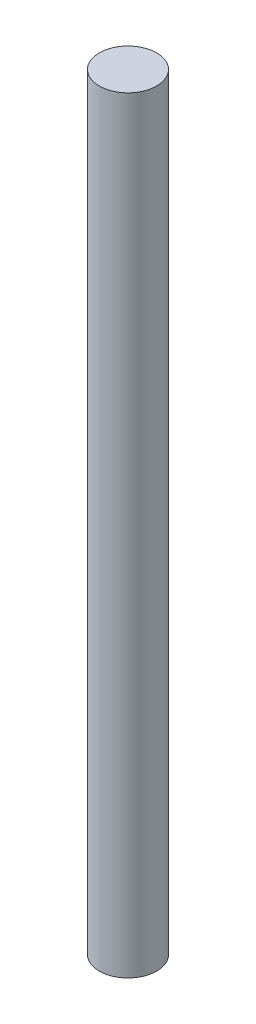
ISO-10303-21;
HEADER;
FILE_DESCRIPTION(('STEP AP214'),'2;1');
FILE_NAME('part.step','',(''),(''),'','','');
FILE_SCHEMA(('AUTOMOTIVE_DESIGN { 1 0 10303 214 1 1 1 1 }'));
ENDSEC;
DATA;
#1=APPLICATION_CONTEXT('core data for automotive mechanical design processes');
#2=APPLICATION_PROTOCOL_DEFINITION('international standard','automotive_design',2000,#1);
#3=PRODUCT_CONTEXT('',#1,'mechanical');
#4=PRODUCT('Part','Part','',(#3));
#5=PRODUCT_RELATED_PRODUCT_CATEGORY('part','',(#4));
#6=PRODUCT_DEFINITION_FORMATION('','',#4);
#7=PRODUCT_DEFINITION_CONTEXT('part definition',#1,'design');
#8=PRODUCT_DEFINITION('design','',#6,#7);
#9=PRODUCT_DEFINITION_SHAPE('','',#8);
#10=(LENGTH_UNIT() NAMED_UNIT(*) SI_UNIT(.MILLI.,.METRE.));
#11=(NAMED_UNIT(*) PLANE_ANGLE_UNIT() SI_UNIT($,.RADIAN.));
#12=(NAMED_UNIT(*) SI_UNIT($,.STERADIAN.) SOLID_ANGLE_UNIT());
#13=UNCERTAINTY_MEASURE_WITH_UNIT(LENGTH_MEASURE(1.E-05),#10,'distance_accuracy_value','');
#14=(GEOMETRIC_REPRESENTATION_CONTEXT(3) GLOBAL_UNCERTAINTY_ASSIGNED_CONTEXT((#13)) GLOBAL_UNIT_ASSIGNED_CONTEXT((#10,
#11,#12)) REPRESENTATION_CONTEXT('',''));
#15=CARTESIAN_POINT('',(0.,0.,0.));
#16=DIRECTION('',(0.,0.,1.));
#17=DIRECTION('',(1.,0.,0.));
#18=AXIS2_PLACEMENT_3D('',#15,#16,#17);
#19=CARTESIAN_POINT('',(0.,37.,0.));
#20=DIRECTION('',(0.,-1.,0.));
#21=DIRECTION('',(0.,0.,-1.));
#22=AXIS2_PLACEMENT_3D('',#19,#20,#21);
#23=CYLINDRICAL_SURFACE('',#22,1.385);
#24=CARTESIAN_POINT('',(0.,37.,0.));
#25=DIRECTION('',(0.,1.,0.));
#26=DIRECTION('',(0.,0.,1.));
#27=AXIS2_PLACEMENT_3D('',#24,#25,#26);
#28=CIRCLE('',#27,1.385);
#29=CARTESIAN_POINT('',(0.,37.,1.385));
#30=VERTEX_POINT('',#29);
#31=EDGE_CURVE('E10',#30,#30,#28,.T.);
#32=ORIENTED_EDGE('',*,*,#31,.F.);
#33=EDGE_LOOP('',(#32));
#34=FACE_BOUND('',#33,.T.);
#35=CARTESIAN_POINT('',(0.,0.,0.));
#36=DIRECTION('',(0.,1.,0.));
#37=DIRECTION('',(0.,0.,1.));
#38=AXIS2_PLACEMENT_3D('',#35,#36,#37);
#39=CIRCLE('',#38,1.385);
#40=CARTESIAN_POINT('',(0.,0.,1.385));
#41=VERTEX_POINT('',#40);
#42=EDGE_CURVE('E40',#41,#41,#39,.T.);
#43=ORIENTED_EDGE('',*,*,#42,.T.);
#44=EDGE_LOOP('',(#43));
#45=FACE_BOUND('',#44,.T.);
#46=ADVANCED_FACE('F37',(#34,#45),#23,.T.);
#47=CARTESIAN_POINT('',(0.,37.,0.));
#48=DIRECTION('',(0.,1.,0.));
#49=DIRECTION('',(0.,0.,1.));
#50=AXIS2_PLACEMENT_3D('',#47,#48,#49);
#51=PLANE('',#50);
#52=ORIENTED_EDGE('',*,*,#31,.T.);
#53=EDGE_LOOP('',(#52));
#54=FACE_BOUND('',#53,.T.);
#55=ADVANCED_FACE('F54',(#54),#51,.T.);
#56=CARTESIAN_POINT('',(0.,0.,0.));
#57=DIRECTION('',(0.,1.,0.));
#58=DIRECTION('',(0.,0.,1.));
#59=AXIS2_PLACEMENT_3D('',#56,#57,#58);
#60=PLANE('',#59);
#61=ORIENTED_EDGE('',*,*,#42,.F.);
#62=EDGE_LOOP('',(#61));
#63=FACE_BOUND('',#62,.T.);
#64=ADVANCED_FACE('F52',(#63),#60,.F.);
#65=CLOSED_SHELL('',(#46,#55,#64));
#66=MANIFOLD_SOLID_BREP('B2',#65);
#67=ADVANCED_BREP_SHAPE_REPRESENTATION('',(#18,#66),#14);
#68=SHAPE_DEFINITION_REPRESENTATION(#9,#67);
ENDSEC;
END-ISO-10303-21;
